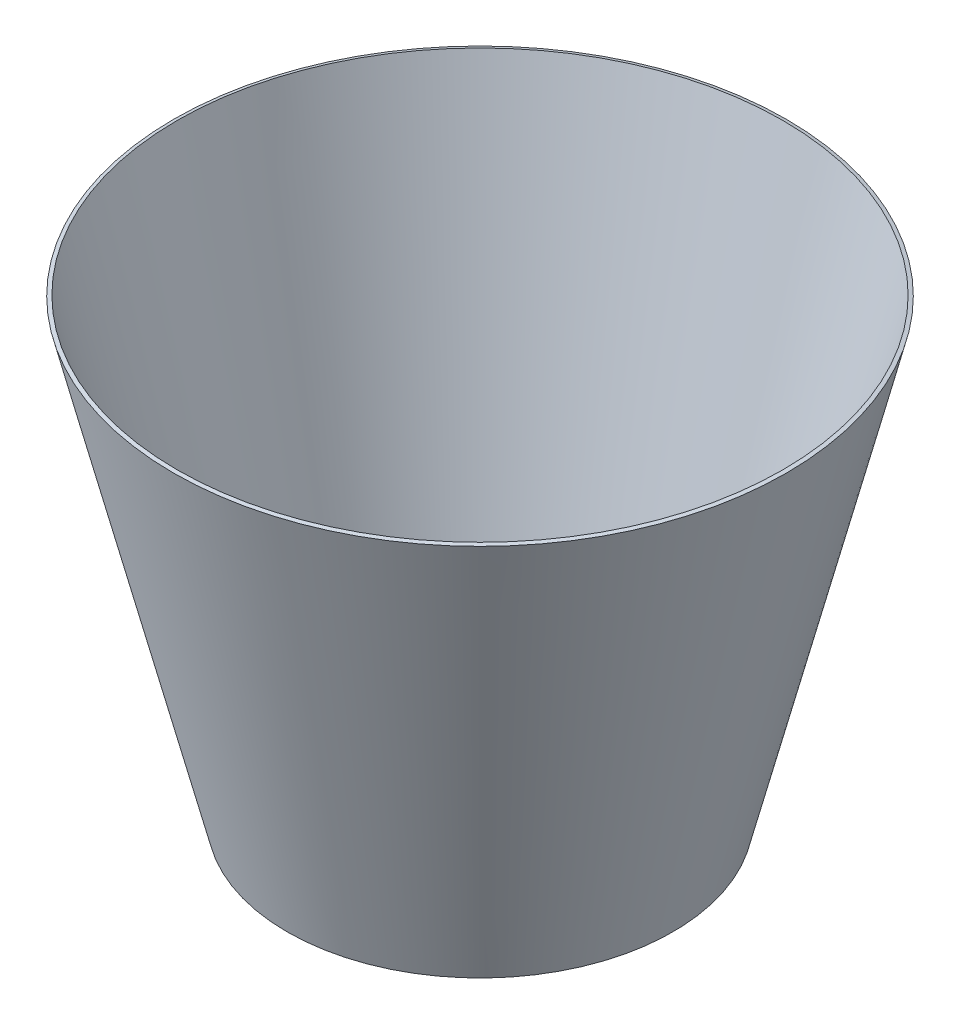
ISO-10303-21;
HEADER;
FILE_DESCRIPTION(('STEP AP214'),'2;1');
FILE_NAME('part.step','',(''),(''),'','','');
FILE_SCHEMA(('AUTOMOTIVE_DESIGN { 1 0 10303 214 1 1 1 1 }'));
ENDSEC;
DATA;
#1=APPLICATION_CONTEXT('core data for automotive mechanical design processes');
#2=APPLICATION_PROTOCOL_DEFINITION('international standard','automotive_design',2000,#1);
#3=PRODUCT_CONTEXT('',#1,'mechanical');
#4=PRODUCT('Part','Part','',(#3));
#5=PRODUCT_RELATED_PRODUCT_CATEGORY('part','',(#4));
#6=PRODUCT_DEFINITION_FORMATION('','',#4);
#7=PRODUCT_DEFINITION_CONTEXT('part definition',#1,'design');
#8=PRODUCT_DEFINITION('design','',#6,#7);
#9=PRODUCT_DEFINITION_SHAPE('','',#8);
#10=(LENGTH_UNIT() NAMED_UNIT(*) SI_UNIT(.MILLI.,.METRE.));
#11=(NAMED_UNIT(*) PLANE_ANGLE_UNIT() SI_UNIT($,.RADIAN.));
#12=(NAMED_UNIT(*) SI_UNIT($,.STERADIAN.) SOLID_ANGLE_UNIT());
#13=UNCERTAINTY_MEASURE_WITH_UNIT(LENGTH_MEASURE(1.E-05),#10,'distance_accuracy_value','');
#14=(GEOMETRIC_REPRESENTATION_CONTEXT(3) GLOBAL_UNCERTAINTY_ASSIGNED_CONTEXT((#13)) GLOBAL_UNIT_ASSIGNED_CONTEXT((#10,
#11,#12)) REPRESENTATION_CONTEXT('',''));
#15=CARTESIAN_POINT('',(0.,0.,0.));
#16=DIRECTION('',(0.,0.,1.));
#17=DIRECTION('',(1.,0.,0.));
#18=AXIS2_PLACEMENT_3D('',#15,#16,#17);
#19=CARTESIAN_POINT('',(0.,-252.467400004209,0.));
#20=DIRECTION('',(0.,1.,0.));
#21=DIRECTION('',(0.,0.,1.));
#22=AXIS2_PLACEMENT_3D('',#19,#20,#21);
#23=CONICAL_SURFACE('',#22,129.464161950369,0.244978663126864);
#24=CARTESIAN_POINT('',(0.,52.3325999957914,0.));
#25=DIRECTION('',(0.,1.,0.));
#26=DIRECTION('',(0.,0.,1.));
#27=AXIS2_PLACEMENT_3D('',#24,#25,#26);
#28=CIRCLE('',#27,205.664161950369);
#29=CARTESIAN_POINT('',(0.,52.3325999957914,205.664161950369));
#30=VERTEX_POINT('',#29);
#31=EDGE_CURVE('E51',#30,#30,#28,.T.);
#32=ORIENTED_EDGE('',*,*,#31,.F.);
#33=EDGE_LOOP('',(#32));
#34=FACE_BOUND('',#33,.T.);
#35=CARTESIAN_POINT('',(0.,-252.467400004209,0.));
#36=DIRECTION('',(0.,1.,0.));
#37=DIRECTION('',(0.,0.,1.));
#38=AXIS2_PLACEMENT_3D('',#35,#36,#37);
#39=CIRCLE('',#38,129.464161950369);
#40=CARTESIAN_POINT('',(0.,-252.467400004209,129.464161950369));
#41=VERTEX_POINT('',#40);
#42=EDGE_CURVE('E10',#41,#41,#39,.T.);
#43=ORIENTED_EDGE('',*,*,#42,.T.);
#44=EDGE_LOOP('',(#43));
#45=FACE_BOUND('',#44,.T.);
#46=ADVANCED_FACE('F37',(#34,#45),#23,.T.);
#47=CARTESIAN_POINT('',(0.,-252.467400004209,0.));
#48=DIRECTION('',(0.,-1.,0.));
#49=DIRECTION('',(0.,0.,-1.));
#50=AXIS2_PLACEMENT_3D('',#47,#48,#49);
#51=CONICAL_SURFACE('',#50,129.464161950369,1.32581766366803);
#52=CARTESIAN_POINT('',(0.,-251.851359516616,0.));
#53=DIRECTION('',(0.,1.,0.));
#54=DIRECTION('',(0.,0.,1.));
#55=AXIS2_PLACEMENT_3D('',#52,#53,#54);
#56=CIRCLE('',#55,127.);
#57=CARTESIAN_POINT('',(0.,-251.851359516616,127.));
#58=VERTEX_POINT('',#57);
#59=EDGE_CURVE('E43',#58,#58,#56,.T.);
#60=ORIENTED_EDGE('',*,*,#59,.T.);
#61=EDGE_LOOP('',(#60));
#62=FACE_BOUND('',#61,.T.);
#63=ORIENTED_EDGE('',*,*,#42,.F.);
#64=EDGE_LOOP('',(#63));
#65=FACE_BOUND('',#64,.T.);
#66=ADVANCED_FACE('F61',(#62,#65),#51,.F.);
#67=CARTESIAN_POINT('',(0.,-251.851359516616,0.));
#68=DIRECTION('',(0.,1.,0.));
#69=DIRECTION('',(0.,0.,1.));
#70=AXIS2_PLACEMENT_3D('',#67,#68,#69);
#71=CONICAL_SURFACE('',#70,127.,0.244978663126864);
#72=CARTESIAN_POINT('',(0.,52.9486404833837,0.));
#73=DIRECTION('',(0.,1.,0.));
#74=DIRECTION('',(0.,0.,1.));
#75=AXIS2_PLACEMENT_3D('',#72,#73,#74);
#76=CIRCLE('',#75,203.2);
#77=CARTESIAN_POINT('',(0.,52.9486404833837,203.2));
#78=VERTEX_POINT('',#77);
#79=EDGE_CURVE('E47',#78,#78,#76,.T.);
#80=ORIENTED_EDGE('',*,*,#79,.T.);
#81=EDGE_LOOP('',(#80));
#82=FACE_BOUND('',#81,.T.);
#83=ORIENTED_EDGE('',*,*,#59,.F.);
#84=EDGE_LOOP('',(#83));
#85=FACE_BOUND('',#84,.T.);
#86=ADVANCED_FACE('F65',(#82,#85),#71,.F.);
#87=CARTESIAN_POINT('',(0.,52.9486404833837,0.));
#88=DIRECTION('',(0.,-1.,0.));
#89=DIRECTION('',(0.,0.,-1.));
#90=AXIS2_PLACEMENT_3D('',#87,#88,#89);
#91=CONICAL_SURFACE('',#90,203.2,1.32581766366801);
#92=ORIENTED_EDGE('',*,*,#31,.T.);
#93=EDGE_LOOP('',(#92));
#94=FACE_BOUND('',#93,.T.);
#95=ORIENTED_EDGE('',*,*,#79,.F.);
#96=EDGE_LOOP('',(#95));
#97=FACE_BOUND('',#96,.T.);
#98=ADVANCED_FACE('F57',(#94,#97),#91,.T.);
#99=CLOSED_SHELL('',(#46,#66,#86,#98));
#100=MANIFOLD_SOLID_BREP('B2',#99);
#101=ADVANCED_BREP_SHAPE_REPRESENTATION('',(#18,#100),#14);
#102=SHAPE_DEFINITION_REPRESENTATION(#9,#101);
ENDSEC;
END-ISO-10303-21;
